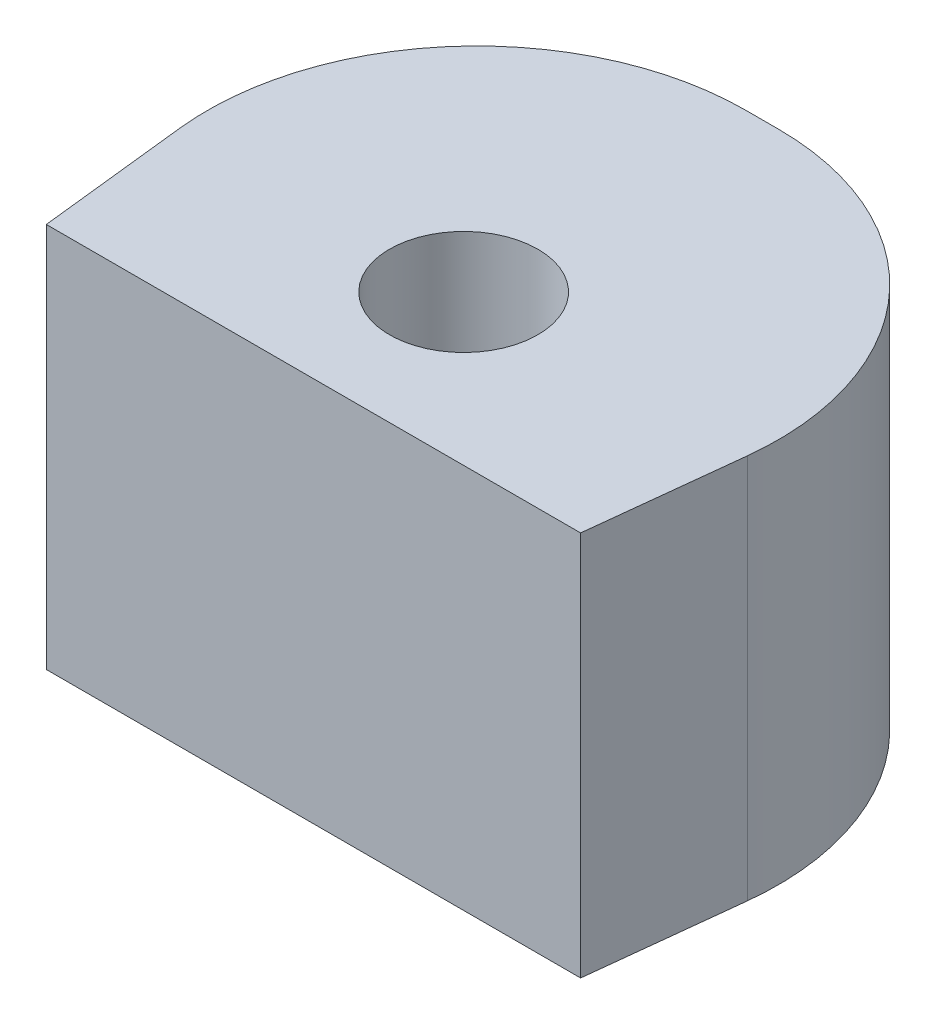
ISO-10303-21;
HEADER;
FILE_DESCRIPTION(('STEP AP214'),'2;1');
FILE_NAME('part.step','',(''),(''),'','','');
FILE_SCHEMA(('AUTOMOTIVE_DESIGN { 1 0 10303 214 1 1 1 1 }'));
ENDSEC;
DATA;
#1=APPLICATION_CONTEXT('core data for automotive mechanical design processes');
#2=APPLICATION_PROTOCOL_DEFINITION('international standard','automotive_design',2000,#1);
#3=PRODUCT_CONTEXT('',#1,'mechanical');
#4=PRODUCT('Part','Part','',(#3));
#5=PRODUCT_RELATED_PRODUCT_CATEGORY('part','',(#4));
#6=PRODUCT_DEFINITION_FORMATION('','',#4);
#7=PRODUCT_DEFINITION_CONTEXT('part definition',#1,'design');
#8=PRODUCT_DEFINITION('design','',#6,#7);
#9=PRODUCT_DEFINITION_SHAPE('','',#8);
#10=(LENGTH_UNIT() NAMED_UNIT(*) SI_UNIT(.MILLI.,.METRE.));
#11=(NAMED_UNIT(*) PLANE_ANGLE_UNIT() SI_UNIT($,.RADIAN.));
#12=(NAMED_UNIT(*) SI_UNIT($,.STERADIAN.) SOLID_ANGLE_UNIT());
#13=UNCERTAINTY_MEASURE_WITH_UNIT(LENGTH_MEASURE(1.E-05),#10,'distance_accuracy_value','');
#14=(GEOMETRIC_REPRESENTATION_CONTEXT(3) GLOBAL_UNCERTAINTY_ASSIGNED_CONTEXT((#13)) GLOBAL_UNIT_ASSIGNED_CONTEXT((#10,
#11,#12)) REPRESENTATION_CONTEXT('',''));
#15=CARTESIAN_POINT('',(0.,0.,0.));
#16=DIRECTION('',(0.,0.,1.));
#17=DIRECTION('',(1.,0.,0.));
#18=AXIS2_PLACEMENT_3D('',#15,#16,#17);
#19=CARTESIAN_POINT('',(-9.25951888196291,165.106922355691,99.8737783562964));
#20=DIRECTION('',(0.,-1.,0.));
#21=DIRECTION('',(0.,0.,-1.));
#22=AXIS2_PLACEMENT_3D('',#19,#20,#21);
#23=PLANE('',#22);
#24=CARTESIAN_POINT('',(-8.38670742850917,165.106922355691,20.7524515728352));
#25=CARTESIAN_POINT('',(-5.77036767929202,165.106922355691,47.1872196515421));
#26=CARTESIAN_POINT('',(-2.31115252231645,165.106922355691,73.5317641629202));
#27=CARTESIAN_POINT('',(1.10809611059364,165.106922355691,99.8737783562964));
#28=B_SPLINE_CURVE_WITH_KNOTS('',3,(#24,#25,#26,#27),.UNSPECIFIED.,.F.,.F.,(4,4),(0.,
0.384969625903912),.UNSPECIFIED.);
#29=CARTESIAN_POINT('',(-6.45468300279155,165.106922355691,39.012456678177));
#30=VERTEX_POINT('',#29);
#31=CARTESIAN_POINT('',(-6.9253777548343,165.106922355691,34.7605521374397));
#32=VERTEX_POINT('',#31);
#33=EDGE_CURVE('E190',#30,#32,#28,.F.);
#34=ORIENTED_EDGE('',*,*,#33,.F.);
#35=DIRECTION('',(1.,0.,0.));
#36=VECTOR('',#35,1.);
#37=CARTESIAN_POINT('',(-35.7381827274976,165.106922355691,39.012456678177));
#38=LINE('',#37,#36);
#39=CARTESIAN_POINT('',(8.67087522397931,165.106922355691,39.012456678177));
#40=VERTEX_POINT('',#39);
#41=EDGE_CURVE('E92',#30,#40,#38,.T.);
#42=ORIENTED_EDGE('',*,*,#41,.T.);
#43=CARTESIAN_POINT('',(1.10809611059364,165.106922355691,99.8737783562964));
#44=CARTESIAN_POINT('',(4.52734474351301,165.106922355691,73.5317641629186));
#45=CARTESIAN_POINT('',(7.98655990047842,165.106922355691,47.187219651543));
#46=CARTESIAN_POINT('',(10.6028996496958,165.106922355691,20.7524515728353));
#47=B_SPLINE_CURVE_WITH_KNOTS('',3,(#43,#44,#45,#46),.UNSPECIFIED.,.F.,.F.,(4,4),(0.,
0.384969625903911),.UNSPECIFIED.);
#48=CARTESIAN_POINT('',(9.14156997602183,165.106922355691,34.7605521374382));
#49=VERTEX_POINT('',#48);
#50=EDGE_CURVE('E61',#49,#40,#47,.F.);
#51=ORIENTED_EDGE('',*,*,#50,.F.);
#52=CARTESIAN_POINT('',(1.56669981803556,165.106922355691,33.932456678177));
#53=DIRECTION('',(0.,-1.,0.));
#54=DIRECTION('',(0.,0.,-1.));
#55=AXIS2_PLACEMENT_3D('',#52,#53,#54);
#56=CIRCLE('',#55,7.62);
#57=CARTESIAN_POINT('',(1.56669981803556,165.106922355691,26.312456678177));
#58=VERTEX_POINT('',#57);
#59=EDGE_CURVE('E177',#49,#58,#56,.F.);
#60=ORIENTED_EDGE('',*,*,#59,.T.);
#61=DIRECTION('',(1.,0.,0.));
#62=VECTOR('',#61,1.);
#63=CARTESIAN_POINT('',(-9.95528734648911,165.106922355691,26.312456678177));
#64=LINE('',#63,#62);
#65=CARTESIAN_POINT('',(0.6494924031518,165.106922355691,26.312456678177));
#66=VERTEX_POINT('',#65);
#67=EDGE_CURVE('E180',#66,#58,#64,.T.);
#68=ORIENTED_EDGE('',*,*,#67,.F.);
#69=CARTESIAN_POINT('',(0.649492403151799,165.106922355691,33.932456678177));
#70=DIRECTION('',(0.,-1.,0.));
#71=DIRECTION('',(0.,0.,-1.));
#72=AXIS2_PLACEMENT_3D('',#69,#70,#71);
#73=CIRCLE('',#72,7.62);
#74=EDGE_CURVE('E198',#66,#32,#73,.F.);
#75=ORIENTED_EDGE('',*,*,#74,.T.);
#76=EDGE_LOOP('',(#34,#42,#51,#60,#68,#75));
#77=FACE_BOUND('',#76,.T.);
#78=CARTESIAN_POINT('',(1.10809611059353,165.106922355691,34.7605521374388));
#79=DIRECTION('',(0.,-1.,0.));
#80=DIRECTION('',(0.,0.,-1.));
#81=AXIS2_PLACEMENT_3D('',#78,#79,#80);
#82=CIRCLE('',#81,2.1);
#83=CARTESIAN_POINT('',(1.10809611059353,165.106922355691,32.6605521374388));
#84=VERTEX_POINT('',#83);
#85=EDGE_CURVE('E97',#84,#84,#82,.F.);
#86=ORIENTED_EDGE('',*,*,#85,.F.);
#87=EDGE_LOOP('',(#86));
#88=FACE_BOUND('',#87,.T.);
#89=ADVANCED_FACE('F38',(#77,#88),#23,.F.);
#90=CARTESIAN_POINT('',(-9.25951888196291,154.195082355691,99.8737783562964));
#91=DIRECTION('',(0.,1.,0.));
#92=DIRECTION('',(0.,0.,1.));
#93=AXIS2_PLACEMENT_3D('',#90,#91,#92);
#94=PLANE('',#93);
#95=CARTESIAN_POINT('',(1.10809611059364,154.195082355691,99.8737783562964));
#96=CARTESIAN_POINT('',(4.52734474351301,154.195082355691,73.5317641629186));
#97=CARTESIAN_POINT('',(7.98655990047842,154.195082355691,47.187219651543));
#98=CARTESIAN_POINT('',(10.6028996496958,154.195082355691,20.7524515728353));
#99=B_SPLINE_CURVE_WITH_KNOTS('',3,(#95,#96,#97,#98),.UNSPECIFIED.,.F.,.F.,(4,4),(0.,
0.384969625903911),.UNSPECIFIED.);
#100=CARTESIAN_POINT('',(8.67087522397883,154.195082355691,39.0124566816617));
#101=VERTEX_POINT('',#100);
#102=CARTESIAN_POINT('',(9.1415699760218,154.195082355691,34.7605521374385));
#103=VERTEX_POINT('',#102);
#104=EDGE_CURVE('E106',#101,#103,#99,.T.);
#105=ORIENTED_EDGE('',*,*,#104,.F.);
#106=DIRECTION('',(1.,0.,0.));
#107=VECTOR('',#106,1.);
#108=CARTESIAN_POINT('',(-35.7381827274976,154.195082355691,39.012456678177));
#109=LINE('',#108,#107);
#110=CARTESIAN_POINT('',(-6.45468300279155,154.195082355691,39.012456678177));
#111=VERTEX_POINT('',#110);
#112=EDGE_CURVE('E54',#111,#101,#109,.T.);
#113=ORIENTED_EDGE('',*,*,#112,.F.);
#114=CARTESIAN_POINT('',(-8.38670742850917,154.195082355691,20.7524515728352));
#115=CARTESIAN_POINT('',(-5.77036767929202,154.195082355691,47.1872196515421));
#116=CARTESIAN_POINT('',(-2.31115252231645,154.195082355691,73.5317641629202));
#117=CARTESIAN_POINT('',(1.10809611059364,154.195082355691,99.8737783562964));
#118=B_SPLINE_CURVE_WITH_KNOTS('',3,(#114,#115,#116,#117),.UNSPECIFIED.,.F.,.F.,(4,4),(0.,
0.384969625903912),.UNSPECIFIED.);
#119=CARTESIAN_POINT('',(-6.9253777548343,154.195082355691,34.7605521374397));
#120=VERTEX_POINT('',#119);
#121=EDGE_CURVE('E103',#120,#111,#118,.T.);
#122=ORIENTED_EDGE('',*,*,#121,.F.);
#123=CARTESIAN_POINT('',(0.649492403151799,154.195082355691,33.932456678177));
#124=DIRECTION('',(0.,1.,0.));
#125=DIRECTION('',(0.,0.,1.));
#126=AXIS2_PLACEMENT_3D('',#123,#124,#125);
#127=CIRCLE('',#126,7.62);
#128=CARTESIAN_POINT('',(0.6494924031518,154.195082355691,26.312456678177));
#129=VERTEX_POINT('',#128);
#130=EDGE_CURVE('E114',#120,#129,#127,.F.);
#131=ORIENTED_EDGE('',*,*,#130,.T.);
#132=DIRECTION('',(-1.,0.,0.));
#133=VECTOR('',#132,1.);
#134=CARTESIAN_POINT('',(-9.95528734648911,154.195082355691,26.312456678177));
#135=LINE('',#134,#133);
#136=CARTESIAN_POINT('',(1.56669981803556,154.195082355691,26.312456678177));
#137=VERTEX_POINT('',#136);
#138=EDGE_CURVE('E119',#137,#129,#135,.T.);
#139=ORIENTED_EDGE('',*,*,#138,.F.);
#140=CARTESIAN_POINT('',(1.56669981803556,154.195082355691,33.932456678177));
#141=DIRECTION('',(0.,1.,0.));
#142=DIRECTION('',(0.,0.,1.));
#143=AXIS2_PLACEMENT_3D('',#140,#141,#142);
#144=CIRCLE('',#143,7.62);
#145=EDGE_CURVE('E207',#137,#103,#144,.F.);
#146=ORIENTED_EDGE('',*,*,#145,.T.);
#147=EDGE_LOOP('',(#105,#113,#122,#131,#139,#146));
#148=FACE_BOUND('',#147,.T.);
#149=CARTESIAN_POINT('',(1.10809611059353,154.195082355691,34.7605521374388));
#150=DIRECTION('',(0.,1.,0.));
#151=DIRECTION('',(0.,0.,1.));
#152=AXIS2_PLACEMENT_3D('',#149,#150,#151);
#153=CIRCLE('',#152,2.1);
#154=CARTESIAN_POINT('',(1.10809611059353,154.195082355691,32.6605521374388));
#155=VERTEX_POINT('',#154);
#156=EDGE_CURVE('E173',#155,#155,#153,.F.);
#157=ORIENTED_EDGE('',*,*,#156,.F.);
#158=EDGE_LOOP('',(#157));
#159=FACE_BOUND('',#158,.T.);
#160=ADVANCED_FACE('F101',(#148,#159),#94,.F.);
#161=CARTESIAN_POINT('',(1.10809611059353,169.87266,34.7605521374388));
#162=DIRECTION('',(0.,-1.,0.));
#163=DIRECTION('',(0.,0.,-1.));
#164=AXIS2_PLACEMENT_3D('',#161,#162,#163);
#165=CYLINDRICAL_SURFACE('',#164,2.1);
#166=CARTESIAN_POINT('',(1.10809611059353,154.195082355691,32.6605521374388));
#167=CARTESIAN_POINT('',(1.10809611059353,154.308747355691,32.6605521374388));
#168=CARTESIAN_POINT('',(1.10809611059353,154.422412355691,32.6605521374388));
#169=CARTESIAN_POINT('',(1.10809611059353,154.649742355691,32.6605521374388));
#170=CARTESIAN_POINT('',(1.10809611059353,154.763407355691,32.6605521374388));
#171=CARTESIAN_POINT('',(1.10809611059353,154.990737355691,32.6605521374388));
#172=CARTESIAN_POINT('',(1.10809611059353,155.104402355691,32.6605521374388));
#173=CARTESIAN_POINT('',(1.10809611059353,155.331732355691,32.6605521374388));
#174=CARTESIAN_POINT('',(1.10809611059353,155.445397355691,32.6605521374388));
#175=CARTESIAN_POINT('',(1.10809611059353,155.672727355691,32.6605521374388));
#176=CARTESIAN_POINT('',(1.10809611059353,155.786392355691,32.6605521374388));
#177=CARTESIAN_POINT('',(1.10809611059353,156.013722355691,32.6605521374388));
#178=CARTESIAN_POINT('',(1.10809611059353,156.127387355691,32.6605521374388));
#179=CARTESIAN_POINT('',(1.10809611059353,156.354717355691,32.6605521374388));
#180=CARTESIAN_POINT('',(1.10809611059353,156.468382355691,32.6605521374388));
#181=CARTESIAN_POINT('',(1.10809611059353,156.695712355691,32.6605521374388));
#182=CARTESIAN_POINT('',(1.10809611059353,156.809377355691,32.6605521374388));
#183=CARTESIAN_POINT('',(1.10809611059353,157.036707355691,32.6605521374388));
#184=CARTESIAN_POINT('',(1.10809611059353,157.150372355691,32.6605521374388));
#185=CARTESIAN_POINT('',(1.10809611059353,157.377702355691,32.6605521374388));
#186=CARTESIAN_POINT('',(1.10809611059353,157.491367355691,32.6605521374388));
#187=CARTESIAN_POINT('',(1.10809611059353,157.718697355691,32.6605521374388));
#188=CARTESIAN_POINT('',(1.10809611059353,157.832362355691,32.6605521374388));
#189=CARTESIAN_POINT('',(1.10809611059353,158.059692355691,32.6605521374388));
#190=CARTESIAN_POINT('',(1.10809611059353,158.173357355691,32.6605521374388));
#191=CARTESIAN_POINT('',(1.10809611059353,158.400687355691,32.6605521374388));
#192=CARTESIAN_POINT('',(1.10809611059353,158.514352355691,32.6605521374388));
#193=CARTESIAN_POINT('',(1.10809611059353,158.741682355691,32.6605521374388));
#194=CARTESIAN_POINT('',(1.10809611059353,158.855347355691,32.6605521374388));
#195=CARTESIAN_POINT('',(1.10809611059353,159.082677355691,32.6605521374388));
#196=CARTESIAN_POINT('',(1.10809611059353,159.196342355691,32.6605521374388));
#197=CARTESIAN_POINT('',(1.10809611059353,159.423672355691,32.6605521374388));
#198=CARTESIAN_POINT('',(1.10809611059353,159.537337355691,32.6605521374388));
#199=CARTESIAN_POINT('',(1.10809611059353,159.764667355691,32.6605521374388));
#200=CARTESIAN_POINT('',(1.10809611059353,159.878332355691,32.6605521374388));
#201=CARTESIAN_POINT('',(1.10809611059353,160.105662355691,32.6605521374388));
#202=CARTESIAN_POINT('',(1.10809611059353,160.219327355691,32.6605521374388));
#203=CARTESIAN_POINT('',(1.10809611059353,160.446657355691,32.6605521374388));
#204=CARTESIAN_POINT('',(1.10809611059353,160.560322355691,32.6605521374388));
#205=CARTESIAN_POINT('',(1.10809611059353,160.787652355691,32.6605521374388));
#206=CARTESIAN_POINT('',(1.10809611059353,160.901317355691,32.6605521374388));
#207=CARTESIAN_POINT('',(1.10809611059353,161.128647355691,32.6605521374388));
#208=CARTESIAN_POINT('',(1.10809611059353,161.242312355691,32.6605521374388));
#209=CARTESIAN_POINT('',(1.10809611059353,161.469642355691,32.6605521374388));
#210=CARTESIAN_POINT('',(1.10809611059353,161.583307355691,32.6605521374388));
#211=CARTESIAN_POINT('',(1.10809611059353,161.810637355691,32.6605521374388));
#212=CARTESIAN_POINT('',(1.10809611059353,161.924302355691,32.6605521374388));
#213=CARTESIAN_POINT('',(1.10809611059353,162.151632355691,32.6605521374388));
#214=CARTESIAN_POINT('',(1.10809611059353,162.265297355691,32.6605521374388));
#215=CARTESIAN_POINT('',(1.10809611059353,162.492627355691,32.6605521374388));
#216=CARTESIAN_POINT('',(1.10809611059353,162.606292355691,32.6605521374388));
#217=CARTESIAN_POINT('',(1.10809611059353,162.833622355691,32.6605521374388));
#218=CARTESIAN_POINT('',(1.10809611059353,162.947287355691,32.6605521374388));
#219=CARTESIAN_POINT('',(1.10809611059353,163.174617355691,32.6605521374388));
#220=CARTESIAN_POINT('',(1.10809611059353,163.288282355691,32.6605521374388));
#221=CARTESIAN_POINT('',(1.10809611059353,163.515612355691,32.6605521374388));
#222=CARTESIAN_POINT('',(1.10809611059353,163.629277355691,32.6605521374388));
#223=CARTESIAN_POINT('',(1.10809611059353,163.856607355691,32.6605521374388));
#224=CARTESIAN_POINT('',(1.10809611059353,163.970272355691,32.6605521374388));
#225=CARTESIAN_POINT('',(1.10809611059353,164.197602355691,32.6605521374388));
#226=CARTESIAN_POINT('',(1.10809611059353,164.311267355691,32.6605521374388));
#227=CARTESIAN_POINT('',(1.10809611059353,164.538597355691,32.6605521374388));
#228=CARTESIAN_POINT('',(1.10809611059353,164.652262355691,32.6605521374388));
#229=CARTESIAN_POINT('',(1.10809611059353,164.879592355691,32.6605521374388));
#230=CARTESIAN_POINT('',(1.10809611059353,164.993257355691,32.6605521374388));
#231=CARTESIAN_POINT('',(1.10809611059353,165.106922355691,32.6605521374388));
#232=B_SPLINE_CURVE_WITH_KNOTS('',3,(#166,#167,#168,#169,#170,#171,#172,#173,#174,#175,#176,
#177,#178,#179,#180,#181,#182,#183,#184,#185,#186,#187,#188,#189,#190,#191,#192,#193,#194,#195,
#196,#197,#198,#199,#200,#201,#202,#203,#204,#205,#206,#207,#208,#209,#210,#211,#212,#213,#214,
#215,#216,#217,#218,#219,#220,#221,#222,#223,#224,#225,#226,#227,#228,#229,#230,#231),
.UNSPECIFIED.,.F.,.F.,(4,2,2,2,2,2,2,2,2,2,2,2,2,2,2,2,2,2,2,2,2,2,2,2,2,2,2,2,2,2,2,2,4),(0.,
0.340995000000011,0.681990000000021,1.022985,1.36398000000001,1.70497500000003,2.04597000000001,
2.38696500000002,2.72796000000003,3.06895500000001,3.40995000000002,3.75094500000003,
4.09194000000002,4.43293500000003,4.77393000000004,5.11492500000002,5.45592000000003,
5.79691500000004,6.13791000000002,6.47890500000003,6.81990000000004,7.16089500000003,
7.50189000000004,7.84288500000005,8.18388000000003,8.52487500000004,8.86587000000005,
9.20686500000004,9.54786000000005,9.88885500000006,10.22985,10.5708450000001,10.9118400000001),.UNSPECIFIED.);
#233=EDGE_CURVE('BSEAM145',#155,#84,#232,.T.);
#234=ORIENTED_EDGE('',*,*,#156,.T.);
#235=ORIENTED_EDGE('',*,*,#85,.T.);
#236=ORIENTED_EDGE('',*,*,#233,.T.);
#237=ORIENTED_EDGE('',*,*,#233,.F.);
#238=EDGE_LOOP('',(#234,#236,#235,#237));
#239=FACE_BOUND('',#238,.T.);
#240=ADVANCED_FACE('F145',(#239),#165,.F.);
#241=CARTESIAN_POINT('',(-8.38670742850917,169.87266,20.7524515728352));
#242=CARTESIAN_POINT('',(-5.77036767929202,169.87266,47.1872196515421));
#243=CARTESIAN_POINT('',(-2.31115252231645,169.87266,73.5317641629202));
#244=CARTESIAN_POINT('',(1.10809611059364,169.87266,99.8737783562964));
#245=B_SPLINE_CURVE_WITH_KNOTS('',3,(#241,#242,#243,#244),.UNSPECIFIED.,.F.,.F.,(4,4),(0.,
0.384969625903912),.UNSPECIFIED.);
#246=DIRECTION('',(0.,-1.,0.));
#247=VECTOR('',#246,1.);
#248=SURFACE_OF_LINEAR_EXTRUSION('',#245,#247);
#249=ORIENTED_EDGE('',*,*,#121,.T.);
#250=DIRECTION('',(0.,-1.,0.));
#251=VECTOR('',#250,1.);
#252=CARTESIAN_POINT('',(-6.4546830031815,159.651002355691,39.012456678177));
#253=LINE('',#252,#251);
#254=EDGE_CURVE('E90',#111,#30,#253,.F.);
#255=ORIENTED_EDGE('',*,*,#254,.T.);
#256=ORIENTED_EDGE('',*,*,#33,.T.);
#257=DIRECTION('',(0.,-1.,0.));
#258=VECTOR('',#257,1.);
#259=CARTESIAN_POINT('',(-6.92537775483439,169.87266,34.7605521374389));
#260=LINE('',#259,#258);
#261=EDGE_CURVE('E112',#32,#120,#260,.T.);
#262=ORIENTED_EDGE('',*,*,#261,.T.);
#263=EDGE_LOOP('',(#249,#255,#256,#262));
#264=FACE_BOUND('',#263,.T.);
#265=ADVANCED_FACE('F110',(#264),#248,.F.);
#266=CARTESIAN_POINT('',(1.10809611059364,169.87266,99.8737783562964));
#267=CARTESIAN_POINT('',(4.52734474351301,169.87266,73.5317641629186));
#268=CARTESIAN_POINT('',(7.98655990047842,169.87266,47.187219651543));
#269=CARTESIAN_POINT('',(10.6028996496958,169.87266,20.7524515728353));
#270=B_SPLINE_CURVE_WITH_KNOTS('',3,(#266,#267,#268,#269),.UNSPECIFIED.,.F.,.F.,(4,4),(0.,
0.384969625903911),.UNSPECIFIED.);
#271=DIRECTION('',(0.,-1.,0.));
#272=VECTOR('',#271,1.);
#273=SURFACE_OF_LINEAR_EXTRUSION('',#270,#272);
#274=ORIENTED_EDGE('',*,*,#50,.T.);
#275=DIRECTION('',(0.,-1.,0.));
#276=VECTOR('',#275,1.);
#277=CARTESIAN_POINT('',(8.6708752243693,159.651002355691,39.012456678177));
#278=LINE('',#277,#276);
#279=EDGE_CURVE('E11',#40,#101,#278,.T.);
#280=ORIENTED_EDGE('',*,*,#279,.T.);
#281=ORIENTED_EDGE('',*,*,#104,.T.);
#282=DIRECTION('',(0.,-1.,0.));
#283=VECTOR('',#282,1.);
#284=CARTESIAN_POINT('',(9.14156997602183,146.81454,34.7605521374382));
#285=LINE('',#284,#283);
#286=EDGE_CURVE('E220',#103,#49,#285,.F.);
#287=ORIENTED_EDGE('',*,*,#286,.T.);
#288=EDGE_LOOP('',(#274,#280,#281,#287));
#289=FACE_BOUND('',#288,.T.);
#290=ADVANCED_FACE('F144',(#289),#273,.F.);
#291=CARTESIAN_POINT('',(-9.95528734648911,146.81454,26.312456678177));
#292=DIRECTION('',(0.,0.,1.));
#293=DIRECTION('',(1.,0.,0.));
#294=AXIS2_PLACEMENT_3D('',#291,#292,#293);
#295=PLANE('',#294);
#296=DIRECTION('',(0.,-1.,0.));
#297=VECTOR('',#296,1.);
#298=CARTESIAN_POINT('',(1.56669981803556,146.81454,26.312456678177));
#299=LINE('',#298,#297);
#300=EDGE_CURVE('E215',#58,#137,#299,.T.);
#301=ORIENTED_EDGE('',*,*,#300,.T.);
#302=ORIENTED_EDGE('',*,*,#138,.T.);
#303=DIRECTION('',(0.,-1.,0.));
#304=VECTOR('',#303,1.);
#305=CARTESIAN_POINT('',(0.6494924031518,146.81454,26.312456678177));
#306=LINE('',#305,#304);
#307=EDGE_CURVE('E47',#129,#66,#306,.F.);
#308=ORIENTED_EDGE('',*,*,#307,.T.);
#309=ORIENTED_EDGE('',*,*,#67,.T.);
#310=EDGE_LOOP('',(#301,#302,#308,#309));
#311=FACE_BOUND('',#310,.T.);
#312=ADVANCED_FACE('F149',(#311),#295,.F.);
#313=CARTESIAN_POINT('',(0.649492403151799,158.3436,33.932456678177));
#314=DIRECTION('',(0.,-1.,0.));
#315=DIRECTION('',(0.,0.,-1.));
#316=AXIS2_PLACEMENT_3D('',#313,#314,#315);
#317=CYLINDRICAL_SURFACE('',#316,7.62);
#318=ORIENTED_EDGE('',*,*,#130,.F.);
#319=ORIENTED_EDGE('',*,*,#261,.F.);
#320=ORIENTED_EDGE('',*,*,#74,.F.);
#321=ORIENTED_EDGE('',*,*,#307,.F.);
#322=EDGE_LOOP('',(#318,#319,#320,#321));
#323=FACE_BOUND('',#322,.T.);
#324=ADVANCED_FACE('F147',(#323),#317,.T.);
#325=CARTESIAN_POINT('',(1.56669981803556,158.3436,33.932456678177));
#326=DIRECTION('',(0.,-1.,0.));
#327=DIRECTION('',(0.,0.,-1.));
#328=AXIS2_PLACEMENT_3D('',#325,#326,#327);
#329=CYLINDRICAL_SURFACE('',#328,7.62);
#330=ORIENTED_EDGE('',*,*,#145,.F.);
#331=ORIENTED_EDGE('',*,*,#300,.F.);
#332=ORIENTED_EDGE('',*,*,#59,.F.);
#333=ORIENTED_EDGE('',*,*,#286,.F.);
#334=EDGE_LOOP('',(#330,#331,#332,#333));
#335=FACE_BOUND('',#334,.T.);
#336=ADVANCED_FACE('F40',(#335),#329,.T.);
#337=CARTESIAN_POINT('',(-35.7381827274976,165.106922355691,39.012456678177));
#338=DIRECTION('',(0.,0.,-1.));
#339=DIRECTION('',(-1.,0.,0.));
#340=AXIS2_PLACEMENT_3D('',#337,#338,#339);
#341=PLANE('',#340);
#342=ORIENTED_EDGE('',*,*,#112,.T.);
#343=ORIENTED_EDGE('',*,*,#279,.F.);
#344=ORIENTED_EDGE('',*,*,#41,.F.);
#345=ORIENTED_EDGE('',*,*,#254,.F.);
#346=EDGE_LOOP('',(#342,#343,#344,#345));
#347=FACE_BOUND('',#346,.T.);
#348=ADVANCED_FACE('F91',(#347),#341,.F.);
#349=CLOSED_SHELL('',(#89,#160,#240,#265,#290,#312,#324,#336,#348));
#350=MANIFOLD_SOLID_BREP('B2',#349);
#351=ADVANCED_BREP_SHAPE_REPRESENTATION('',(#18,#350),#14);
#352=SHAPE_DEFINITION_REPRESENTATION(#9,#351);
ENDSEC;
END-ISO-10303-21;
